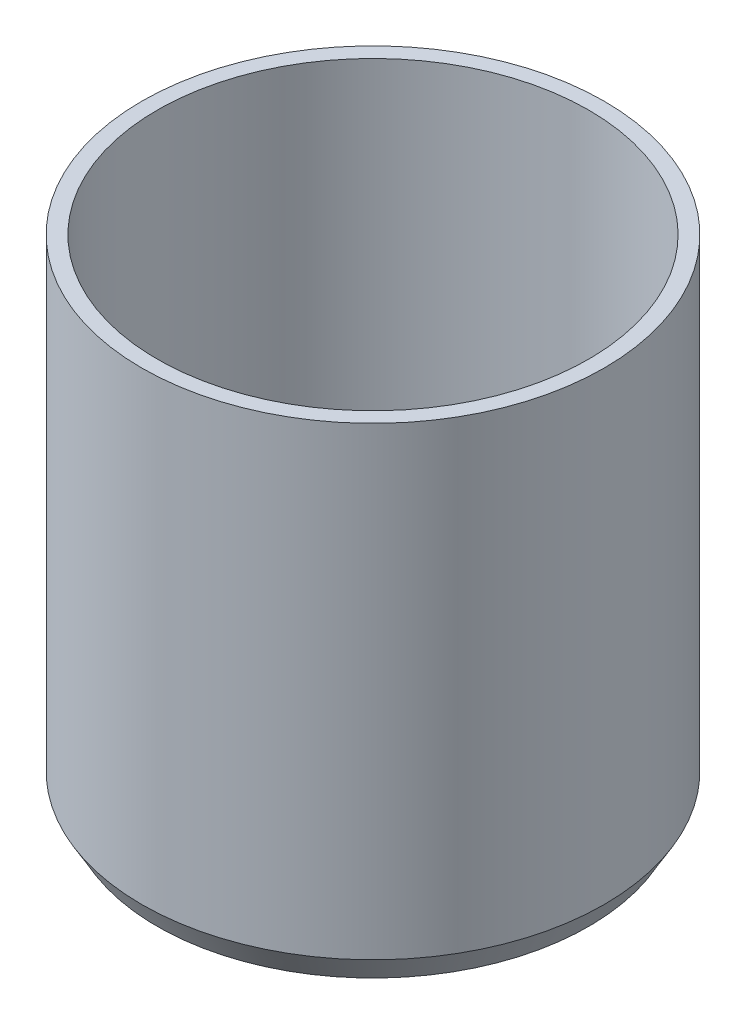
ISO-10303-21;
HEADER;
FILE_DESCRIPTION(('STEP AP214'),'2;1');
FILE_NAME('part.step','',(''),(''),'','','');
FILE_SCHEMA(('AUTOMOTIVE_DESIGN { 1 0 10303 214 1 1 1 1 }'));
ENDSEC;
DATA;
#1=APPLICATION_CONTEXT('core data for automotive mechanical design processes');
#2=APPLICATION_PROTOCOL_DEFINITION('international standard','automotive_design',2000,#1);
#3=PRODUCT_CONTEXT('',#1,'mechanical');
#4=PRODUCT('Part','Part','',(#3));
#5=PRODUCT_RELATED_PRODUCT_CATEGORY('part','',(#4));
#6=PRODUCT_DEFINITION_FORMATION('','',#4);
#7=PRODUCT_DEFINITION_CONTEXT('part definition',#1,'design');
#8=PRODUCT_DEFINITION('design','',#6,#7);
#9=PRODUCT_DEFINITION_SHAPE('','',#8);
#10=(LENGTH_UNIT() NAMED_UNIT(*) SI_UNIT(.MILLI.,.METRE.));
#11=(NAMED_UNIT(*) PLANE_ANGLE_UNIT() SI_UNIT($,.RADIAN.));
#12=(NAMED_UNIT(*) SI_UNIT($,.STERADIAN.) SOLID_ANGLE_UNIT());
#13=UNCERTAINTY_MEASURE_WITH_UNIT(LENGTH_MEASURE(1.E-05),#10,'distance_accuracy_value','');
#14=(GEOMETRIC_REPRESENTATION_CONTEXT(3) GLOBAL_UNCERTAINTY_ASSIGNED_CONTEXT((#13)) GLOBAL_UNIT_ASSIGNED_CONTEXT((#10,
#11,#12)) REPRESENTATION_CONTEXT('',''));
#15=CARTESIAN_POINT('',(0.,0.,0.));
#16=DIRECTION('',(0.,0.,1.));
#17=DIRECTION('',(1.,0.,0.));
#18=AXIS2_PLACEMENT_3D('',#15,#16,#17);
#19=CARTESIAN_POINT('',(0.,0.,0.));
#20=DIRECTION('',(0.,-1.,0.));
#21=DIRECTION('',(0.,0.,-1.));
#22=AXIS2_PLACEMENT_3D('',#19,#20,#21);
#23=PLANE('',#22);
#24=CARTESIAN_POINT('',(0.,0.,0.));
#25=DIRECTION('',(0.,-1.,0.));
#26=DIRECTION('',(0.,0.,-1.));
#27=AXIS2_PLACEMENT_3D('',#24,#25,#26);
#28=CIRCLE('',#27,70.);
#29=CARTESIAN_POINT('',(0.,0.,-70.));
#30=VERTEX_POINT('',#29);
#31=EDGE_CURVE('E10',#30,#30,#28,.T.);
#32=ORIENTED_EDGE('',*,*,#31,.T.);
#33=EDGE_LOOP('',(#32));
#34=FACE_BOUND('',#33,.T.);
#35=ADVANCED_FACE('F30',(#34),#23,.T.);
#36=CARTESIAN_POINT('',(0.,0.,0.));
#37=DIRECTION('',(0.,1.,0.));
#38=DIRECTION('',(0.,0.,1.));
#39=AXIS2_PLACEMENT_3D('',#36,#37,#38);
#40=CONICAL_SURFACE('',#39,70.,0.523598775598296);
#41=CARTESIAN_POINT('',(0.,8.66025403784445,0.));
#42=DIRECTION('',(0.,-1.,0.));
#43=DIRECTION('',(0.,0.,-1.));
#44=AXIS2_PLACEMENT_3D('',#41,#42,#43);
#45=CIRCLE('',#44,75.);
#46=CARTESIAN_POINT('',(0.,8.66025403784445,-75.));
#47=VERTEX_POINT('',#46);
#48=EDGE_CURVE('E36',#47,#47,#45,.T.);
#49=ORIENTED_EDGE('',*,*,#48,.T.);
#50=EDGE_LOOP('',(#49));
#51=FACE_BOUND('',#50,.T.);
#52=ORIENTED_EDGE('',*,*,#31,.F.);
#53=EDGE_LOOP('',(#52));
#54=FACE_BOUND('',#53,.T.);
#55=ADVANCED_FACE('F68',(#51,#54),#40,.T.);
#56=CARTESIAN_POINT('',(0.,0.,0.));
#57=DIRECTION('',(0.,-1.,0.));
#58=DIRECTION('',(0.,0.,-1.));
#59=AXIS2_PLACEMENT_3D('',#56,#57,#58);
#60=CYLINDRICAL_SURFACE('',#59,75.);
#61=CARTESIAN_POINT('',(0.,159.397681060003,0.));
#62=DIRECTION('',(0.,-1.,0.));
#63=DIRECTION('',(0.,0.,-1.));
#64=AXIS2_PLACEMENT_3D('',#61,#62,#63);
#65=CIRCLE('',#64,75.);
#66=CARTESIAN_POINT('',(0.,159.397681060003,-75.));
#67=VERTEX_POINT('',#66);
#68=EDGE_CURVE('E40',#67,#67,#65,.T.);
#69=ORIENTED_EDGE('',*,*,#68,.T.);
#70=EDGE_LOOP('',(#69));
#71=FACE_BOUND('',#70,.T.);
#72=ORIENTED_EDGE('',*,*,#48,.F.);
#73=EDGE_LOOP('',(#72));
#74=FACE_BOUND('',#73,.T.);
#75=ADVANCED_FACE('F72',(#71,#74),#60,.T.);
#76=CARTESIAN_POINT('',(75.,159.397681060003,0.));
#77=DIRECTION('',(0.,1.,0.));
#78=DIRECTION('',(0.,0.,1.));
#79=AXIS2_PLACEMENT_3D('',#76,#77,#78);
#80=PLANE('',#79);
#81=CARTESIAN_POINT('',(0.,159.397681060003,0.));
#82=DIRECTION('',(0.,-1.,0.));
#83=DIRECTION('',(0.,0.,-1.));
#84=AXIS2_PLACEMENT_3D('',#81,#82,#83);
#85=CIRCLE('',#84,70.);
#86=CARTESIAN_POINT('',(0.,159.397681060003,-70.));
#87=VERTEX_POINT('',#86);
#88=EDGE_CURVE('E44',#87,#87,#85,.T.);
#89=ORIENTED_EDGE('',*,*,#88,.T.);
#90=EDGE_LOOP('',(#89));
#91=FACE_BOUND('',#90,.T.);
#92=ORIENTED_EDGE('',*,*,#68,.F.);
#93=EDGE_LOOP('',(#92));
#94=FACE_BOUND('',#93,.T.);
#95=ADVANCED_FACE('F76',(#91,#94),#80,.T.);
#96=CARTESIAN_POINT('',(0.,0.,0.));
#97=DIRECTION('',(0.,-1.,0.));
#98=DIRECTION('',(0.,0.,-1.));
#99=AXIS2_PLACEMENT_3D('',#96,#97,#98);
#100=CYLINDRICAL_SURFACE('',#99,70.);
#101=CARTESIAN_POINT('',(0.,11.82806693944,0.));
#102=DIRECTION('',(0.,-1.,0.));
#103=DIRECTION('',(0.,0.,-1.));
#104=AXIS2_PLACEMENT_3D('',#101,#102,#103);
#105=CIRCLE('',#104,70.);
#106=CARTESIAN_POINT('',(0.,11.82806693944,-70.));
#107=VERTEX_POINT('',#106);
#108=EDGE_CURVE('E49',#107,#107,#105,.T.);
#109=ORIENTED_EDGE('',*,*,#108,.T.);
#110=EDGE_LOOP('',(#109));
#111=FACE_BOUND('',#110,.T.);
#112=ORIENTED_EDGE('',*,*,#88,.F.);
#113=EDGE_LOOP('',(#112));
#114=FACE_BOUND('',#113,.T.);
#115=ADVANCED_FACE('F65',(#111,#114),#100,.F.);
#116=CARTESIAN_POINT('',(0.,11.82806693944,0.));
#117=DIRECTION('',(0.,1.,0.));
#118=DIRECTION('',(0.,0.,1.));
#119=AXIS2_PLACEMENT_3D('',#116,#117,#118);
#120=CONICAL_SURFACE('',#119,70.,0.36308813457406);
#121=CARTESIAN_POINT('',(0.,5.,0.));
#122=DIRECTION('',(0.,-1.,0.));
#123=DIRECTION('',(0.,0.,-1.));
#124=AXIS2_PLACEMENT_3D('',#121,#122,#123);
#125=CIRCLE('',#124,67.4057946072222);
#126=CARTESIAN_POINT('',(0.,5.,-67.4057946072222));
#127=VERTEX_POINT('',#126);
#128=EDGE_CURVE('E52',#127,#127,#125,.T.);
#129=ORIENTED_EDGE('',*,*,#128,.T.);
#130=EDGE_LOOP('',(#129));
#131=FACE_BOUND('',#130,.T.);
#132=ORIENTED_EDGE('',*,*,#108,.F.);
#133=EDGE_LOOP('',(#132));
#134=FACE_BOUND('',#133,.T.);
#135=ADVANCED_FACE('F56',(#131,#134),#120,.F.);
#136=CARTESIAN_POINT('',(67.4057946072222,5.,0.));
#137=DIRECTION('',(0.,1.,0.));
#138=DIRECTION('',(0.,0.,1.));
#139=AXIS2_PLACEMENT_3D('',#136,#137,#138);
#140=PLANE('',#139);
#141=ORIENTED_EDGE('',*,*,#128,.F.);
#142=EDGE_LOOP('',(#141));
#143=FACE_BOUND('',#142,.T.);
#144=ADVANCED_FACE('F59',(#143),#140,.T.);
#145=CLOSED_SHELL('',(#35,#55,#75,#95,#115,#135,#144));
#146=MANIFOLD_SOLID_BREP('B2',#145);
#147=ADVANCED_BREP_SHAPE_REPRESENTATION('',(#18,#146),#14);
#148=SHAPE_DEFINITION_REPRESENTATION(#9,#147);
ENDSEC;
END-ISO-10303-21;
